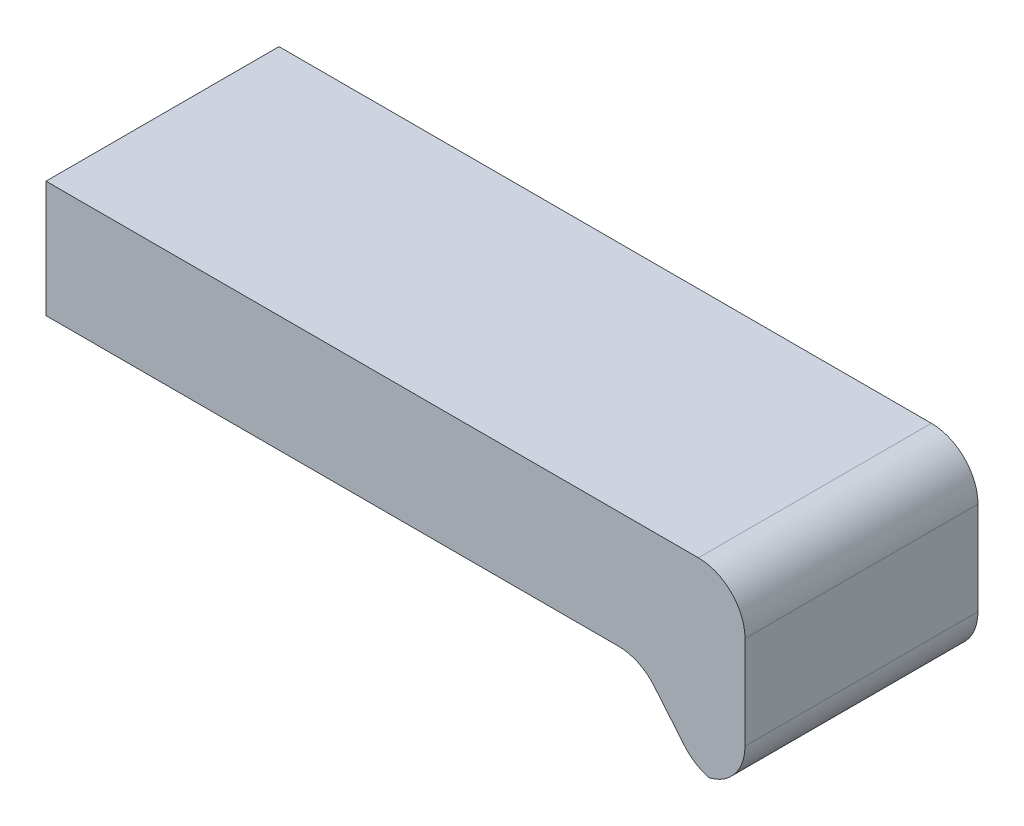
ISO-10303-21;
HEADER;
FILE_DESCRIPTION(('STEP AP214'),'2;1');
FILE_NAME('part.step','',(''),(''),'','','');
FILE_SCHEMA(('AUTOMOTIVE_DESIGN { 1 0 10303 214 1 1 1 1 }'));
ENDSEC;
DATA;
#1=APPLICATION_CONTEXT('core data for automotive mechanical design processes');
#2=APPLICATION_PROTOCOL_DEFINITION('international standard','automotive_design',2000,#1);
#3=PRODUCT_CONTEXT('',#1,'mechanical');
#4=PRODUCT('Part','Part','',(#3));
#5=PRODUCT_RELATED_PRODUCT_CATEGORY('part','',(#4));
#6=PRODUCT_DEFINITION_FORMATION('','',#4);
#7=PRODUCT_DEFINITION_CONTEXT('part definition',#1,'design');
#8=PRODUCT_DEFINITION('design','',#6,#7);
#9=PRODUCT_DEFINITION_SHAPE('','',#8);
#10=(LENGTH_UNIT() NAMED_UNIT(*) SI_UNIT(.MILLI.,.METRE.));
#11=(NAMED_UNIT(*) PLANE_ANGLE_UNIT() SI_UNIT($,.RADIAN.));
#12=(NAMED_UNIT(*) SI_UNIT($,.STERADIAN.) SOLID_ANGLE_UNIT());
#13=UNCERTAINTY_MEASURE_WITH_UNIT(LENGTH_MEASURE(1.E-05),#10,'distance_accuracy_value','');
#14=(GEOMETRIC_REPRESENTATION_CONTEXT(3) GLOBAL_UNCERTAINTY_ASSIGNED_CONTEXT((#13)) GLOBAL_UNIT_ASSIGNED_CONTEXT((#10,
#11,#12)) REPRESENTATION_CONTEXT('',''));
#15=CARTESIAN_POINT('',(0.,0.,0.));
#16=DIRECTION('',(0.,0.,1.));
#17=DIRECTION('',(1.,0.,0.));
#18=AXIS2_PLACEMENT_3D('',#15,#16,#17);
#19=CARTESIAN_POINT('',(14.,-1.5,5.));
#20=DIRECTION('',(-0.768221279597376,-0.640184399664479,0.));
#21=DIRECTION('',(0.640184399664479,-0.768221279597376,0.));
#22=AXIS2_PLACEMENT_3D('',#19,#20,#21);
#23=PLANE('',#22);
#24=DIRECTION('',(-0.640184399664479,0.768221279597376,0.));
#25=VECTOR('',#24,1.);
#26=CARTESIAN_POINT('',(14.,-1.5,5.));
#27=LINE('',#26,#25);
#28=CARTESIAN_POINT('',(13.7001536663871,-1.14018439966448,5.));
#29=VERTEX_POINT('',#28);
#30=CARTESIAN_POINT('',(13.0498463336129,-0.359815600335521,5.));
#31=VERTEX_POINT('',#30);
#32=EDGE_CURVE('E120',#29,#31,#27,.T.);
#33=ORIENTED_EDGE('',*,*,#32,.T.);
#34=DIRECTION('',(0.,0.,-1.));
#35=VECTOR('',#34,1.);
#36=CARTESIAN_POINT('',(13.0498463336129,-0.359815600335521,0.));
#37=LINE('',#36,#35);
#38=CARTESIAN_POINT('',(13.0498463336129,-0.359815600335521,0.));
#39=VERTEX_POINT('',#38);
#40=EDGE_CURVE('E195',#31,#39,#37,.T.);
#41=ORIENTED_EDGE('',*,*,#40,.T.);
#42=DIRECTION('',(-0.640184399664479,0.768221279597376,0.));
#43=VECTOR('',#42,1.);
#44=CARTESIAN_POINT('',(14.,-1.5,0.));
#45=LINE('',#44,#43);
#46=CARTESIAN_POINT('',(13.7001536663871,-1.14018439966448,0.));
#47=VERTEX_POINT('',#46);
#48=EDGE_CURVE('E145',#47,#39,#45,.T.);
#49=ORIENTED_EDGE('',*,*,#48,.F.);
#50=DIRECTION('',(0.,0.,-1.));
#51=VECTOR('',#50,1.);
#52=CARTESIAN_POINT('',(13.7001536663871,-1.14018439966448,5.));
#53=LINE('',#52,#51);
#54=EDGE_CURVE('E192',#47,#29,#53,.F.);
#55=ORIENTED_EDGE('',*,*,#54,.T.);
#56=EDGE_LOOP('',(#33,#41,#49,#55));
#57=FACE_BOUND('',#56,.T.);
#58=ADVANCED_FACE('F39',(#57),#23,.T.);
#59=CARTESIAN_POINT('',(15.,2.5,5.));
#60=DIRECTION('',(1.,0.,0.));
#61=DIRECTION('',(0.,0.,-1.));
#62=AXIS2_PLACEMENT_3D('',#59,#60,#61);
#63=PLANE('',#62);
#64=DIRECTION('',(0.,-1.,0.));
#65=VECTOR('',#64,1.);
#66=CARTESIAN_POINT('',(15.,2.5,0.));
#67=LINE('',#66,#65);
#68=CARTESIAN_POINT('',(15.,1.5,0.));
#69=VERTEX_POINT('',#68);
#70=CARTESIAN_POINT('',(15.,-0.500000000000001,0.));
#71=VERTEX_POINT('',#70);
#72=EDGE_CURVE('E158',#69,#71,#67,.T.);
#73=ORIENTED_EDGE('',*,*,#72,.F.);
#74=DIRECTION('',(0.,0.,-1.));
#75=VECTOR('',#74,1.);
#76=CARTESIAN_POINT('',(15.,1.5,5.));
#77=LINE('',#76,#75);
#78=CARTESIAN_POINT('',(15.,1.5,5.));
#79=VERTEX_POINT('',#78);
#80=EDGE_CURVE('E181',#69,#79,#77,.F.);
#81=ORIENTED_EDGE('',*,*,#80,.T.);
#82=DIRECTION('',(0.,-1.,0.));
#83=VECTOR('',#82,1.);
#84=CARTESIAN_POINT('',(15.,2.5,5.));
#85=LINE('',#84,#83);
#86=CARTESIAN_POINT('',(15.,-0.500000000000001,5.));
#87=VERTEX_POINT('',#86);
#88=EDGE_CURVE('E129',#79,#87,#85,.T.);
#89=ORIENTED_EDGE('',*,*,#88,.T.);
#90=DIRECTION('',(0.,0.,-1.));
#91=VECTOR('',#90,1.);
#92=CARTESIAN_POINT('',(15.,-0.500000000000001,5.));
#93=LINE('',#92,#91);
#94=EDGE_CURVE('E177',#87,#71,#93,.T.);
#95=ORIENTED_EDGE('',*,*,#94,.T.);
#96=EDGE_LOOP('',(#73,#81,#89,#95));
#97=FACE_BOUND('',#96,.T.);
#98=ADVANCED_FACE('F223',(#97),#63,.T.);
#99=CARTESIAN_POINT('',(0.,2.5,5.));
#100=DIRECTION('',(0.,1.,0.));
#101=DIRECTION('',(0.,0.,1.));
#102=AXIS2_PLACEMENT_3D('',#99,#100,#101);
#103=PLANE('',#102);
#104=DIRECTION('',(1.,0.,0.));
#105=VECTOR('',#104,1.);
#106=CARTESIAN_POINT('',(0.,2.5,5.));
#107=LINE('',#106,#105);
#108=CARTESIAN_POINT('',(0.,2.5,5.));
#109=VERTEX_POINT('',#108);
#110=CARTESIAN_POINT('',(14.,2.5,5.));
#111=VERTEX_POINT('',#110);
#112=EDGE_CURVE('E135',#109,#111,#107,.T.);
#113=ORIENTED_EDGE('',*,*,#112,.T.);
#114=DIRECTION('',(0.,0.,-1.));
#115=VECTOR('',#114,1.);
#116=CARTESIAN_POINT('',(14.,2.5,5.));
#117=LINE('',#116,#115);
#118=CARTESIAN_POINT('',(14.,2.5,0.));
#119=VERTEX_POINT('',#118);
#120=EDGE_CURVE('E163',#111,#119,#117,.T.);
#121=ORIENTED_EDGE('',*,*,#120,.T.);
#122=DIRECTION('',(1.,0.,0.));
#123=VECTOR('',#122,1.);
#124=CARTESIAN_POINT('',(0.,2.5,0.));
#125=LINE('',#124,#123);
#126=CARTESIAN_POINT('',(0.,2.5,0.));
#127=VERTEX_POINT('',#126);
#128=EDGE_CURVE('E154',#127,#119,#125,.T.);
#129=ORIENTED_EDGE('',*,*,#128,.F.);
#130=DIRECTION('',(0.,0.,-1.));
#131=VECTOR('',#130,1.);
#132=CARTESIAN_POINT('',(0.,2.5,5.));
#133=LINE('',#132,#131);
#134=EDGE_CURVE('E128',#109,#127,#133,.T.);
#135=ORIENTED_EDGE('',*,*,#134,.F.);
#136=EDGE_LOOP('',(#113,#121,#129,#135));
#137=FACE_BOUND('',#136,.T.);
#138=ADVANCED_FACE('F229',(#137),#103,.T.);
#139=CARTESIAN_POINT('',(0.,0.,5.));
#140=DIRECTION('',(-1.,0.,0.));
#141=DIRECTION('',(0.,0.,1.));
#142=AXIS2_PLACEMENT_3D('',#139,#140,#141);
#143=PLANE('',#142);
#144=DIRECTION('',(0.,1.,0.));
#145=VECTOR('',#144,1.);
#146=CARTESIAN_POINT('',(0.,0.,0.));
#147=LINE('',#146,#145);
#148=CARTESIAN_POINT('',(0.,0.,0.));
#149=VERTEX_POINT('',#148);
#150=EDGE_CURVE('E126',#149,#127,#147,.T.);
#151=ORIENTED_EDGE('',*,*,#150,.F.);
#152=DIRECTION('',(0.,0.,-1.));
#153=VECTOR('',#152,1.);
#154=CARTESIAN_POINT('',(0.,0.,5.));
#155=LINE('',#154,#153);
#156=CARTESIAN_POINT('',(0.,0.,5.));
#157=VERTEX_POINT('',#156);
#158=EDGE_CURVE('E114',#157,#149,#155,.T.);
#159=ORIENTED_EDGE('',*,*,#158,.F.);
#160=DIRECTION('',(0.,1.,0.));
#161=VECTOR('',#160,1.);
#162=CARTESIAN_POINT('',(0.,0.,5.));
#163=LINE('',#162,#161);
#164=EDGE_CURVE('E119',#157,#109,#163,.T.);
#165=ORIENTED_EDGE('',*,*,#164,.T.);
#166=ORIENTED_EDGE('',*,*,#134,.T.);
#167=EDGE_LOOP('',(#151,#159,#165,#166));
#168=FACE_BOUND('',#167,.T.);
#169=ADVANCED_FACE('F124',(#168),#143,.T.);
#170=CARTESIAN_POINT('',(12.75,0.,5.));
#171=DIRECTION('',(0.,-1.,0.));
#172=DIRECTION('',(0.,0.,-1.));
#173=AXIS2_PLACEMENT_3D('',#170,#171,#172);
#174=PLANE('',#173);
#175=DIRECTION('',(-1.,0.,0.));
#176=VECTOR('',#175,1.);
#177=CARTESIAN_POINT('',(12.75,0.,0.));
#178=LINE('',#177,#176);
#179=CARTESIAN_POINT('',(12.2816250540156,0.,0.));
#180=VERTEX_POINT('',#179);
#181=EDGE_CURVE('E149',#180,#149,#178,.T.);
#182=ORIENTED_EDGE('',*,*,#181,.F.);
#183=DIRECTION('',(0.,0.,-1.));
#184=VECTOR('',#183,1.);
#185=CARTESIAN_POINT('',(12.2816250540156,0.,5.));
#186=LINE('',#185,#184);
#187=CARTESIAN_POINT('',(12.2816250540156,0.,5.));
#188=VERTEX_POINT('',#187);
#189=EDGE_CURVE('E64',#180,#188,#186,.F.);
#190=ORIENTED_EDGE('',*,*,#189,.T.);
#191=DIRECTION('',(-1.,0.,0.));
#192=VECTOR('',#191,1.);
#193=CARTESIAN_POINT('',(12.75,0.,5.));
#194=LINE('',#193,#192);
#195=EDGE_CURVE('E111',#188,#157,#194,.T.);
#196=ORIENTED_EDGE('',*,*,#195,.T.);
#197=ORIENTED_EDGE('',*,*,#158,.T.);
#198=EDGE_LOOP('',(#182,#190,#196,#197));
#199=FACE_BOUND('',#198,.T.);
#200=ADVANCED_FACE('F113',(#199),#174,.T.);
#201=CARTESIAN_POINT('',(0.,0.,5.));
#202=DIRECTION('',(0.,0.,1.));
#203=DIRECTION('',(1.,0.,0.));
#204=AXIS2_PLACEMENT_3D('',#201,#202,#203);
#205=PLANE('',#204);
#206=ORIENTED_EDGE('',*,*,#88,.F.);
#207=CARTESIAN_POINT('',(14.,1.5,5.));
#208=DIRECTION('',(0.,0.,1.));
#209=DIRECTION('',(1.,0.,0.));
#210=AXIS2_PLACEMENT_3D('',#207,#208,#209);
#211=CIRCLE('',#210,1.);
#212=EDGE_CURVE('E189',#79,#111,#211,.T.);
#213=ORIENTED_EDGE('',*,*,#212,.T.);
#214=ORIENTED_EDGE('',*,*,#112,.F.);
#215=ORIENTED_EDGE('',*,*,#164,.F.);
#216=ORIENTED_EDGE('',*,*,#195,.F.);
#217=CARTESIAN_POINT('',(12.2816250540156,-1.,5.));
#218=DIRECTION('',(0.,0.,1.));
#219=DIRECTION('',(1.,0.,0.));
#220=AXIS2_PLACEMENT_3D('',#217,#218,#219);
#221=CIRCLE('',#220,1.);
#222=EDGE_CURVE('E11',#188,#31,#221,.F.);
#223=ORIENTED_EDGE('',*,*,#222,.T.);
#224=ORIENTED_EDGE('',*,*,#32,.F.);
#225=CARTESIAN_POINT('',(14.4683749459844,-0.500000000000001,5.));
#226=DIRECTION('',(0.,0.,1.));
#227=DIRECTION('',(1.,0.,0.));
#228=AXIS2_PLACEMENT_3D('',#225,#226,#227);
#229=CIRCLE('',#228,1.);
#230=CARTESIAN_POINT('',(14.2341874729922,-1.47219145619241,5.));
#231=VERTEX_POINT('',#230);
#232=EDGE_CURVE('E56',#29,#231,#229,.T.);
#233=ORIENTED_EDGE('',*,*,#232,.T.);
#234=CARTESIAN_POINT('',(14.,-0.500000000000001,5.));
#235=DIRECTION('',(0.,0.,1.));
#236=DIRECTION('',(1.,0.,0.));
#237=AXIS2_PLACEMENT_3D('',#234,#235,#236);
#238=CIRCLE('',#237,1.);
#239=EDGE_CURVE('E186',#231,#87,#238,.T.);
#240=ORIENTED_EDGE('',*,*,#239,.T.);
#241=EDGE_LOOP('',(#206,#213,#214,#215,#216,#223,#224,#233,#240));
#242=FACE_BOUND('',#241,.T.);
#243=ADVANCED_FACE('F133',(#242),#205,.T.);
#244=CARTESIAN_POINT('',(0.,0.,0.));
#245=DIRECTION('',(0.,0.,1.));
#246=DIRECTION('',(1.,0.,0.));
#247=AXIS2_PLACEMENT_3D('',#244,#245,#246);
#248=PLANE('',#247);
#249=ORIENTED_EDGE('',*,*,#128,.T.);
#250=CARTESIAN_POINT('',(14.,1.5,0.));
#251=DIRECTION('',(0.,0.,1.));
#252=DIRECTION('',(1.,0.,0.));
#253=AXIS2_PLACEMENT_3D('',#250,#251,#252);
#254=CIRCLE('',#253,1.);
#255=EDGE_CURVE('E174',#119,#69,#254,.F.);
#256=ORIENTED_EDGE('',*,*,#255,.T.);
#257=ORIENTED_EDGE('',*,*,#72,.T.);
#258=CARTESIAN_POINT('',(14.,-0.500000000000001,0.));
#259=DIRECTION('',(0.,0.,1.));
#260=DIRECTION('',(1.,0.,0.));
#261=AXIS2_PLACEMENT_3D('',#258,#259,#260);
#262=CIRCLE('',#261,1.);
#263=CARTESIAN_POINT('',(14.2341874729922,-1.47219145619241,0.));
#264=VERTEX_POINT('',#263);
#265=EDGE_CURVE('E171',#71,#264,#262,.F.);
#266=ORIENTED_EDGE('',*,*,#265,.T.);
#267=CARTESIAN_POINT('',(14.4683749459844,-0.500000000000001,0.));
#268=DIRECTION('',(0.,0.,1.));
#269=DIRECTION('',(1.,0.,0.));
#270=AXIS2_PLACEMENT_3D('',#267,#268,#269);
#271=CIRCLE('',#270,1.);
#272=EDGE_CURVE('E168',#264,#47,#271,.F.);
#273=ORIENTED_EDGE('',*,*,#272,.T.);
#274=ORIENTED_EDGE('',*,*,#48,.T.);
#275=CARTESIAN_POINT('',(12.2816250540156,-1.,0.));
#276=DIRECTION('',(0.,0.,1.));
#277=DIRECTION('',(1.,0.,0.));
#278=AXIS2_PLACEMENT_3D('',#275,#276,#277);
#279=CIRCLE('',#278,1.);
#280=EDGE_CURVE('E49',#39,#180,#279,.T.);
#281=ORIENTED_EDGE('',*,*,#280,.T.);
#282=ORIENTED_EDGE('',*,*,#181,.T.);
#283=ORIENTED_EDGE('',*,*,#150,.T.);
#284=EDGE_LOOP('',(#249,#256,#257,#266,#273,#274,#281,#282,#283));
#285=FACE_BOUND('',#284,.T.);
#286=ADVANCED_FACE('F203',(#285),#248,.F.);
#287=CARTESIAN_POINT('',(14.,1.5,5.));
#288=DIRECTION('',(0.,0.,-1.));
#289=DIRECTION('',(-1.,0.,0.));
#290=AXIS2_PLACEMENT_3D('',#287,#288,#289);
#291=CYLINDRICAL_SURFACE('',#290,1.);
#292=ORIENTED_EDGE('',*,*,#212,.F.);
#293=ORIENTED_EDGE('',*,*,#80,.F.);
#294=ORIENTED_EDGE('',*,*,#255,.F.);
#295=ORIENTED_EDGE('',*,*,#120,.F.);
#296=EDGE_LOOP('',(#292,#293,#294,#295));
#297=FACE_BOUND('',#296,.T.);
#298=ADVANCED_FACE('F226',(#297),#291,.T.);
#299=CARTESIAN_POINT('',(14.4683749459844,-0.500000000000001,5.));
#300=DIRECTION('',(0.,0.,-1.));
#301=DIRECTION('',(-1.,0.,0.));
#302=AXIS2_PLACEMENT_3D('',#299,#300,#301);
#303=CYLINDRICAL_SURFACE('',#302,1.);
#304=DIRECTION('',(0.,0.,-1.));
#305=VECTOR('',#304,1.);
#306=CARTESIAN_POINT('',(14.2341874729922,-1.47219145619241,2.5));
#307=LINE('',#306,#305);
#308=EDGE_CURVE('E43',#231,#264,#307,.T.);
#309=ORIENTED_EDGE('',*,*,#308,.F.);
#310=ORIENTED_EDGE('',*,*,#232,.F.);
#311=ORIENTED_EDGE('',*,*,#54,.F.);
#312=ORIENTED_EDGE('',*,*,#272,.F.);
#313=EDGE_LOOP('',(#309,#310,#311,#312));
#314=FACE_BOUND('',#313,.T.);
#315=ADVANCED_FACE('F219',(#314),#303,.T.);
#316=CARTESIAN_POINT('',(14.,-0.500000000000001,5.));
#317=DIRECTION('',(0.,0.,-1.));
#318=DIRECTION('',(-1.,0.,0.));
#319=AXIS2_PLACEMENT_3D('',#316,#317,#318);
#320=CYLINDRICAL_SURFACE('',#319,1.);
#321=ORIENTED_EDGE('',*,*,#239,.F.);
#322=ORIENTED_EDGE('',*,*,#308,.T.);
#323=ORIENTED_EDGE('',*,*,#265,.F.);
#324=ORIENTED_EDGE('',*,*,#94,.F.);
#325=EDGE_LOOP('',(#321,#322,#323,#324));
#326=FACE_BOUND('',#325,.T.);
#327=ADVANCED_FACE('F215',(#326),#320,.T.);
#328=CARTESIAN_POINT('',(12.2816250540156,-1.,5.));
#329=DIRECTION('',(0.,0.,1.));
#330=DIRECTION('',(1.,0.,0.));
#331=AXIS2_PLACEMENT_3D('',#328,#329,#330);
#332=CYLINDRICAL_SURFACE('',#331,1.);
#333=ORIENTED_EDGE('',*,*,#222,.F.);
#334=ORIENTED_EDGE('',*,*,#189,.F.);
#335=ORIENTED_EDGE('',*,*,#280,.F.);
#336=ORIENTED_EDGE('',*,*,#40,.F.);
#337=EDGE_LOOP('',(#333,#334,#335,#336));
#338=FACE_BOUND('',#337,.T.);
#339=ADVANCED_FACE('F41',(#338),#332,.F.);
#340=CLOSED_SHELL('',(#58,#98,#138,#169,#200,#243,#286,#298,#315,#327,#339));
#341=MANIFOLD_SOLID_BREP('B2',#340);
#342=ADVANCED_BREP_SHAPE_REPRESENTATION('',(#18,#341),#14);
#343=SHAPE_DEFINITION_REPRESENTATION(#9,#342);
ENDSEC;
END-ISO-10303-21;
